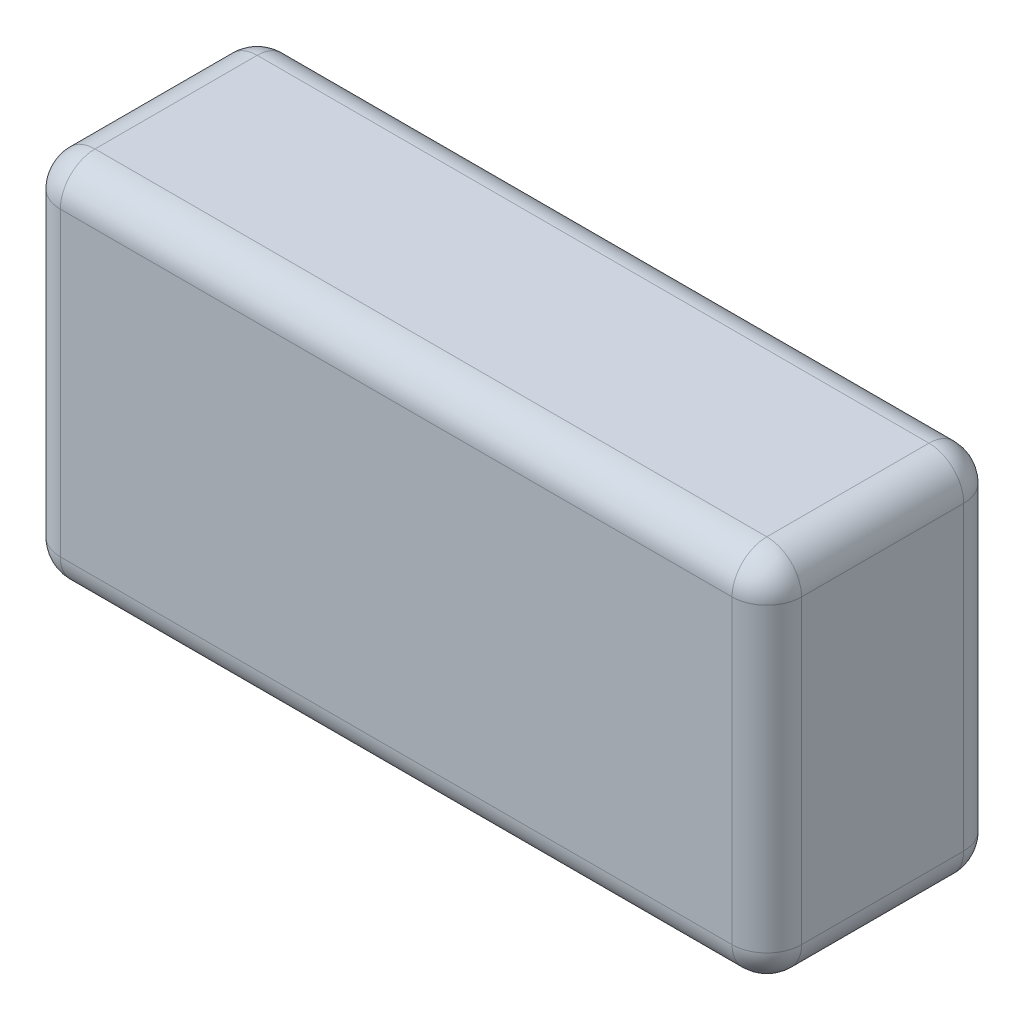
ISO-10303-21;
HEADER;
FILE_DESCRIPTION(('STEP AP214'),'2;1');
FILE_NAME('part.step','',(''),(''),'','','');
FILE_SCHEMA(('AUTOMOTIVE_DESIGN { 1 0 10303 214 1 1 1 1 }'));
ENDSEC;
DATA;
#1=APPLICATION_CONTEXT('core data for automotive mechanical design processes');
#2=APPLICATION_PROTOCOL_DEFINITION('international standard','automotive_design',2000,#1);
#3=PRODUCT_CONTEXT('',#1,'mechanical');
#4=PRODUCT('Part','Part','',(#3));
#5=PRODUCT_RELATED_PRODUCT_CATEGORY('part','',(#4));
#6=PRODUCT_DEFINITION_FORMATION('','',#4);
#7=PRODUCT_DEFINITION_CONTEXT('part definition',#1,'design');
#8=PRODUCT_DEFINITION('design','',#6,#7);
#9=PRODUCT_DEFINITION_SHAPE('','',#8);
#10=(LENGTH_UNIT() NAMED_UNIT(*) SI_UNIT(.MILLI.,.METRE.));
#11=(NAMED_UNIT(*) PLANE_ANGLE_UNIT() SI_UNIT($,.RADIAN.));
#12=(NAMED_UNIT(*) SI_UNIT($,.STERADIAN.) SOLID_ANGLE_UNIT());
#13=UNCERTAINTY_MEASURE_WITH_UNIT(LENGTH_MEASURE(1.E-05),#10,'distance_accuracy_value','');
#14=(GEOMETRIC_REPRESENTATION_CONTEXT(3) GLOBAL_UNCERTAINTY_ASSIGNED_CONTEXT((#13)) GLOBAL_UNIT_ASSIGNED_CONTEXT((#10,
#11,#12)) REPRESENTATION_CONTEXT('',''));
#15=CARTESIAN_POINT('',(0.,0.,0.));
#16=DIRECTION('',(0.,0.,1.));
#17=DIRECTION('',(1.,0.,0.));
#18=AXIS2_PLACEMENT_3D('',#15,#16,#17);
#19=CARTESIAN_POINT('',(-1.45,-0.649999999999998,0.849999999999999));
#20=DIRECTION('',(1.,0.,0.));
#21=DIRECTION('',(0.,0.,1.));
#22=AXIS2_PLACEMENT_3D('',#19,#20,#21);
#23=SPHERICAL_SURFACE('',#22,0.150000000000003);
#24=CARTESIAN_POINT('',(-1.45,-0.65,0.85));
#25=DIRECTION('',(1.,0.,0.));
#26=DIRECTION('',(0.,0.,-1.));
#27=AXIS2_PLACEMENT_3D('',#24,#25,#26);
#28=CIRCLE('',#27,0.15);
#29=CARTESIAN_POINT('',(-1.45,-0.649999999999999,1.));
#30=VERTEX_POINT('',#29);
#31=CARTESIAN_POINT('',(-1.45,-0.8,0.850000000001725));
#32=VERTEX_POINT('',#31);
#33=EDGE_CURVE('E109',#30,#32,#28,.T.);
#34=ORIENTED_EDGE('',*,*,#33,.F.);
#35=CARTESIAN_POINT('',(-1.45,-0.65,0.850000000000004));
#36=DIRECTION('',(0.,-1.,0.));
#37=DIRECTION('',(0.,0.,-1.));
#38=AXIS2_PLACEMENT_3D('',#35,#36,#37);
#39=CIRCLE('',#38,0.149999999999995);
#40=CARTESIAN_POINT('',(-1.6,-0.649999999999999,0.849999999999999));
#41=VERTEX_POINT('',#40);
#42=EDGE_CURVE('E118',#41,#30,#39,.F.);
#43=ORIENTED_EDGE('',*,*,#42,.F.);
#44=CARTESIAN_POINT('',(-1.45000000000001,-0.650000000000005,0.85));
#45=DIRECTION('',(0.,0.,1.));
#46=DIRECTION('',(1.,0.,0.));
#47=AXIS2_PLACEMENT_3D('',#44,#45,#46);
#48=CIRCLE('',#47,0.149999999999994);
#49=EDGE_CURVE('E121',#32,#41,#48,.F.);
#50=ORIENTED_EDGE('',*,*,#49,.F.);
#51=EDGE_LOOP('',(#34,#43,#50));
#52=FACE_BOUND('',#51,.T.);
#53=ADVANCED_FACE('F17',(#52),#23,.T.);
#54=CARTESIAN_POINT('',(1.45,-0.649999999999998,0.849999999999998));
#55=DIRECTION('',(1.,0.,0.));
#56=DIRECTION('',(0.,0.,1.));
#57=AXIS2_PLACEMENT_3D('',#54,#55,#56);
#58=SPHERICAL_SURFACE('',#57,0.150000000000002);
#59=CARTESIAN_POINT('',(1.45,-0.650000000000004,0.85));
#60=DIRECTION('',(0.,0.,1.));
#61=DIRECTION('',(1.,0.,0.));
#62=AXIS2_PLACEMENT_3D('',#59,#60,#61);
#63=CIRCLE('',#62,0.149999999999995);
#64=CARTESIAN_POINT('',(1.6,-0.650000000000001,0.849999999999999));
#65=VERTEX_POINT('',#64);
#66=CARTESIAN_POINT('',(1.45,-0.8,0.85));
#67=VERTEX_POINT('',#66);
#68=EDGE_CURVE('E168',#65,#67,#63,.F.);
#69=ORIENTED_EDGE('',*,*,#68,.F.);
#70=CARTESIAN_POINT('',(1.45,-0.65,0.850000000000004));
#71=DIRECTION('',(0.,1.,0.));
#72=DIRECTION('',(0.,0.,1.));
#73=AXIS2_PLACEMENT_3D('',#70,#71,#72);
#74=CIRCLE('',#73,0.149999999999995);
#75=CARTESIAN_POINT('',(1.45,-0.649999999999999,1.));
#76=VERTEX_POINT('',#75);
#77=EDGE_CURVE('E153',#76,#65,#74,.T.);
#78=ORIENTED_EDGE('',*,*,#77,.F.);
#79=CARTESIAN_POINT('',(1.45,-0.65,0.85));
#80=DIRECTION('',(1.,0.,0.));
#81=DIRECTION('',(0.,0.,-1.));
#82=AXIS2_PLACEMENT_3D('',#79,#80,#81);
#83=CIRCLE('',#82,0.15);
#84=EDGE_CURVE('E111',#67,#76,#83,.F.);
#85=ORIENTED_EDGE('',*,*,#84,.F.);
#86=EDGE_LOOP('',(#69,#78,#85));
#87=FACE_BOUND('',#86,.T.);
#88=ADVANCED_FACE('F137',(#87),#58,.T.);
#89=CARTESIAN_POINT('',(-1.45,-0.65,0.850000000000004));
#90=DIRECTION('',(0.,-1.,0.));
#91=DIRECTION('',(0.,0.,-1.));
#92=AXIS2_PLACEMENT_3D('',#89,#90,#91);
#93=CYLINDRICAL_SURFACE('',#92,0.149999999999995);
#94=CARTESIAN_POINT('',(-1.45,0.649999999999999,0.849999999999999));
#95=DIRECTION('',(0.,-1.,-4.60039669621078E-11));
#96=DIRECTION('',(1.,0.,0.));
#97=AXIS2_PLACEMENT_3D('',#94,#95,#96);
#98=CIRCLE('',#97,0.150000000000001);
#99=CARTESIAN_POINT('',(-1.6,0.65,0.85));
#100=VERTEX_POINT('',#99);
#101=CARTESIAN_POINT('',(-1.45,0.649999999999137,1.));
#102=VERTEX_POINT('',#101);
#103=EDGE_CURVE('E129',#100,#102,#98,.F.);
#104=ORIENTED_EDGE('',*,*,#103,.F.);
#105=DIRECTION('',(0.,1.,0.));
#106=VECTOR('',#105,1.);
#107=CARTESIAN_POINT('',(-1.6,-0.65,0.85));
#108=LINE('',#107,#106);
#109=EDGE_CURVE('E133',#41,#100,#108,.T.);
#110=ORIENTED_EDGE('',*,*,#109,.F.);
#111=ORIENTED_EDGE('',*,*,#42,.T.);
#112=DIRECTION('',(0.,-1.,0.));
#113=VECTOR('',#112,1.);
#114=CARTESIAN_POINT('',(-1.45,-0.65,0.999999999999999));
#115=LINE('',#114,#113);
#116=EDGE_CURVE('E124',#30,#102,#115,.F.);
#117=ORIENTED_EDGE('',*,*,#116,.T.);
#118=EDGE_LOOP('',(#104,#110,#111,#117));
#119=FACE_BOUND('',#118,.T.);
#120=ADVANCED_FACE('F131',(#119),#93,.T.);
#121=CARTESIAN_POINT('',(-1.45,0.649999999999999,0.849999999999999));
#122=DIRECTION('',(1.,0.,0.));
#123=DIRECTION('',(0.,0.,-1.));
#124=AXIS2_PLACEMENT_3D('',#121,#122,#123);
#125=SPHERICAL_SURFACE('',#124,0.150000000000001);
#126=CARTESIAN_POINT('',(-1.45,0.65,0.85));
#127=DIRECTION('',(-1.,0.,0.));
#128=DIRECTION('',(0.,0.,1.));
#129=AXIS2_PLACEMENT_3D('',#126,#127,#128);
#130=CIRCLE('',#129,0.15);
#131=CARTESIAN_POINT('',(-1.45,0.8,0.85));
#132=VERTEX_POINT('',#131);
#133=EDGE_CURVE('E181',#132,#102,#130,.F.);
#134=ORIENTED_EDGE('',*,*,#133,.F.);
#135=CARTESIAN_POINT('',(-1.45,0.650000000000004,0.85));
#136=DIRECTION('',(0.,0.,1.));
#137=DIRECTION('',(1.,0.,0.));
#138=AXIS2_PLACEMENT_3D('',#135,#136,#137);
#139=CIRCLE('',#138,0.149999999999995);
#140=EDGE_CURVE('E175',#100,#132,#139,.F.);
#141=ORIENTED_EDGE('',*,*,#140,.F.);
#142=ORIENTED_EDGE('',*,*,#103,.T.);
#143=EDGE_LOOP('',(#134,#141,#142));
#144=FACE_BOUND('',#143,.T.);
#145=ADVANCED_FACE('F143',(#144),#125,.T.);
#146=CARTESIAN_POINT('',(-1.1,-0.65,1.));
#147=DIRECTION('',(0.,0.,1.));
#148=DIRECTION('',(1.,0.,0.));
#149=AXIS2_PLACEMENT_3D('',#146,#147,#148);
#150=PLANE('',#149);
#151=DIRECTION('',(1.,0.,0.));
#152=VECTOR('',#151,1.);
#153=CARTESIAN_POINT('',(1.45,-0.65,1.));
#154=LINE('',#153,#152);
#155=EDGE_CURVE('E102',#76,#30,#154,.F.);
#156=ORIENTED_EDGE('',*,*,#155,.F.);
#157=DIRECTION('',(0.,1.,0.));
#158=VECTOR('',#157,1.);
#159=CARTESIAN_POINT('',(1.45,0.65,0.999999999999999));
#160=LINE('',#159,#158);
#161=CARTESIAN_POINT('',(1.45,0.65,1.));
#162=VERTEX_POINT('',#161);
#163=EDGE_CURVE('E113',#162,#76,#160,.F.);
#164=ORIENTED_EDGE('',*,*,#163,.F.);
#165=DIRECTION('',(-1.,0.,0.));
#166=VECTOR('',#165,1.);
#167=CARTESIAN_POINT('',(1.1,0.65,1.));
#168=LINE('',#167,#166);
#169=EDGE_CURVE('E126',#102,#162,#168,.F.);
#170=ORIENTED_EDGE('',*,*,#169,.F.);
#171=ORIENTED_EDGE('',*,*,#116,.F.);
#172=EDGE_LOOP('',(#156,#164,#170,#171));
#173=FACE_BOUND('',#172,.T.);
#174=ADVANCED_FACE('F125',(#173),#150,.T.);
#175=CARTESIAN_POINT('',(1.45,0.650000000000001,0.850000000000001));
#176=DIRECTION('',(1.,0.,0.));
#177=DIRECTION('',(0.,0.,-1.));
#178=AXIS2_PLACEMENT_3D('',#175,#176,#177);
#179=SPHERICAL_SURFACE('',#178,0.149999999999998);
#180=CARTESIAN_POINT('',(1.45000000000001,0.650000000000005,0.85));
#181=DIRECTION('',(0.,0.,1.));
#182=DIRECTION('',(1.,0.,0.));
#183=AXIS2_PLACEMENT_3D('',#180,#181,#182);
#184=CIRCLE('',#183,0.149999999999994);
#185=CARTESIAN_POINT('',(1.45,0.8,0.849999999998083));
#186=VERTEX_POINT('',#185);
#187=CARTESIAN_POINT('',(1.6,0.650000000000003,0.850000000000001));
#188=VERTEX_POINT('',#187);
#189=EDGE_CURVE('E187',#186,#188,#184,.F.);
#190=ORIENTED_EDGE('',*,*,#189,.F.);
#191=CARTESIAN_POINT('',(1.45,0.65,0.85));
#192=DIRECTION('',(-1.,0.,0.));
#193=DIRECTION('',(0.,0.,1.));
#194=AXIS2_PLACEMENT_3D('',#191,#192,#193);
#195=CIRCLE('',#194,0.15);
#196=EDGE_CURVE('E184',#162,#186,#195,.T.);
#197=ORIENTED_EDGE('',*,*,#196,.F.);
#198=CARTESIAN_POINT('',(1.45,0.65,0.850000000000004));
#199=DIRECTION('',(0.,1.,0.));
#200=DIRECTION('',(0.,0.,1.));
#201=AXIS2_PLACEMENT_3D('',#198,#199,#200);
#202=CIRCLE('',#201,0.149999999999995);
#203=EDGE_CURVE('E158',#188,#162,#202,.F.);
#204=ORIENTED_EDGE('',*,*,#203,.F.);
#205=EDGE_LOOP('',(#190,#197,#204));
#206=FACE_BOUND('',#205,.T.);
#207=ADVANCED_FACE('F257',(#206),#179,.T.);
#208=CARTESIAN_POINT('',(1.45,0.65,0.850000000000004));
#209=DIRECTION('',(0.,1.,0.));
#210=DIRECTION('',(0.,0.,1.));
#211=AXIS2_PLACEMENT_3D('',#208,#209,#210);
#212=CYLINDRICAL_SURFACE('',#211,0.149999999999995);
#213=ORIENTED_EDGE('',*,*,#203,.T.);
#214=ORIENTED_EDGE('',*,*,#163,.T.);
#215=ORIENTED_EDGE('',*,*,#77,.T.);
#216=DIRECTION('',(0.,1.,0.));
#217=VECTOR('',#216,1.);
#218=CARTESIAN_POINT('',(1.6,0.65,0.85));
#219=LINE('',#218,#217);
#220=EDGE_CURVE('E196',#188,#65,#219,.F.);
#221=ORIENTED_EDGE('',*,*,#220,.F.);
#222=EDGE_LOOP('',(#213,#214,#215,#221));
#223=FACE_BOUND('',#222,.T.);
#224=ADVANCED_FACE('F255',(#223),#212,.T.);
#225=CARTESIAN_POINT('',(1.45,-0.65,0.85));
#226=DIRECTION('',(1.,0.,0.));
#227=DIRECTION('',(0.,0.,-1.));
#228=AXIS2_PLACEMENT_3D('',#225,#226,#227);
#229=CYLINDRICAL_SURFACE('',#228,0.15);
#230=DIRECTION('',(1.,0.,0.));
#231=VECTOR('',#230,1.);
#232=CARTESIAN_POINT('',(1.1,-0.8,0.85));
#233=LINE('',#232,#231);
#234=EDGE_CURVE('E201',#67,#32,#233,.F.);
#235=ORIENTED_EDGE('',*,*,#234,.F.);
#236=ORIENTED_EDGE('',*,*,#84,.T.);
#237=ORIENTED_EDGE('',*,*,#155,.T.);
#238=ORIENTED_EDGE('',*,*,#33,.T.);
#239=EDGE_LOOP('',(#235,#236,#237,#238));
#240=FACE_BOUND('',#239,.T.);
#241=ADVANCED_FACE('F108',(#240),#229,.T.);
#242=CARTESIAN_POINT('',(-1.45000000000001,-0.650000000000005,0.85));
#243=DIRECTION('',(0.,0.,1.));
#244=DIRECTION('',(1.,0.,0.));
#245=AXIS2_PLACEMENT_3D('',#242,#243,#244);
#246=CYLINDRICAL_SURFACE('',#245,0.149999999999994);
#247=ORIENTED_EDGE('',*,*,#49,.T.);
#248=DIRECTION('',(0.,0.,1.));
#249=VECTOR('',#248,1.);
#250=CARTESIAN_POINT('',(-1.6,-0.65,0.15));
#251=LINE('',#250,#249);
#252=CARTESIAN_POINT('',(-1.6,-0.65,0.15));
#253=VERTEX_POINT('',#252);
#254=EDGE_CURVE('E172',#253,#41,#251,.T.);
#255=ORIENTED_EDGE('',*,*,#254,.F.);
#256=CARTESIAN_POINT('',(-1.45,-0.649999999999998,0.150000000000001));
#257=DIRECTION('',(0.,0.,-1.));
#258=DIRECTION('',(1.,0.,0.));
#259=AXIS2_PLACEMENT_3D('',#256,#257,#258);
#260=CIRCLE('',#259,0.150000000000002);
#261=CARTESIAN_POINT('',(-1.45,-0.799999999999999,0.15));
#262=VERTEX_POINT('',#261);
#263=EDGE_CURVE('E206',#262,#253,#260,.T.);
#264=ORIENTED_EDGE('',*,*,#263,.F.);
#265=DIRECTION('',(0.,0.,-1.));
#266=VECTOR('',#265,1.);
#267=CARTESIAN_POINT('',(-1.45,-0.8,0.15));
#268=LINE('',#267,#266);
#269=EDGE_CURVE('E203',#32,#262,#268,.T.);
#270=ORIENTED_EDGE('',*,*,#269,.F.);
#271=EDGE_LOOP('',(#247,#255,#264,#270));
#272=FACE_BOUND('',#271,.T.);
#273=ADVANCED_FACE('F248',(#272),#246,.T.);
#274=CARTESIAN_POINT('',(1.45,-0.650000000000004,0.85));
#275=DIRECTION('',(0.,0.,1.));
#276=DIRECTION('',(1.,0.,0.));
#277=AXIS2_PLACEMENT_3D('',#274,#275,#276);
#278=CYLINDRICAL_SURFACE('',#277,0.149999999999995);
#279=CARTESIAN_POINT('',(1.45,-0.649999999999999,0.150000000000001));
#280=DIRECTION('',(0.,4.72852255648652E-11,-1.));
#281=DIRECTION('',(1.,0.,0.));
#282=AXIS2_PLACEMENT_3D('',#279,#280,#281);
#283=CIRCLE('',#282,0.150000000000003);
#284=CARTESIAN_POINT('',(1.6,-0.650000000000001,0.15));
#285=VERTEX_POINT('',#284);
#286=CARTESIAN_POINT('',(1.45,-0.8,0.149999999999113));
#287=VERTEX_POINT('',#286);
#288=EDGE_CURVE('E209',#285,#287,#283,.T.);
#289=ORIENTED_EDGE('',*,*,#288,.F.);
#290=DIRECTION('',(0.,0.,-1.));
#291=VECTOR('',#290,1.);
#292=CARTESIAN_POINT('',(1.6,-0.65,0.15));
#293=LINE('',#292,#291);
#294=EDGE_CURVE('E190',#65,#285,#293,.T.);
#295=ORIENTED_EDGE('',*,*,#294,.F.);
#296=ORIENTED_EDGE('',*,*,#68,.T.);
#297=DIRECTION('',(0.,0.,-1.));
#298=VECTOR('',#297,1.);
#299=CARTESIAN_POINT('',(1.45,-0.8,0.15));
#300=LINE('',#299,#298);
#301=EDGE_CURVE('E198',#287,#67,#300,.F.);
#302=ORIENTED_EDGE('',*,*,#301,.F.);
#303=EDGE_LOOP('',(#289,#295,#296,#302));
#304=FACE_BOUND('',#303,.T.);
#305=ADVANCED_FACE('F244',(#304),#278,.T.);
#306=CARTESIAN_POINT('',(-1.6,-0.65,0.15));
#307=DIRECTION('',(-1.,0.,0.));
#308=DIRECTION('',(0.,0.,1.));
#309=AXIS2_PLACEMENT_3D('',#306,#307,#308);
#310=PLANE('',#309);
#311=DIRECTION('',(0.,1.,0.));
#312=VECTOR('',#311,1.);
#313=CARTESIAN_POINT('',(-1.59999999999999,0.65,0.15));
#314=LINE('',#313,#312);
#315=CARTESIAN_POINT('',(-1.6,0.650000000000001,0.15));
#316=VERTEX_POINT('',#315);
#317=EDGE_CURVE('E329',#253,#316,#314,.T.);
#318=ORIENTED_EDGE('',*,*,#317,.F.);
#319=ORIENTED_EDGE('',*,*,#254,.T.);
#320=ORIENTED_EDGE('',*,*,#109,.T.);
#321=DIRECTION('',(0.,0.,1.));
#322=VECTOR('',#321,1.);
#323=CARTESIAN_POINT('',(-1.59999999999999,0.65,0.85));
#324=LINE('',#323,#322);
#325=EDGE_CURVE('E178',#316,#100,#324,.T.);
#326=ORIENTED_EDGE('',*,*,#325,.F.);
#327=EDGE_LOOP('',(#318,#319,#320,#326));
#328=FACE_BOUND('',#327,.T.);
#329=ADVANCED_FACE('F240',(#328),#310,.T.);
#330=CARTESIAN_POINT('',(-1.45,0.650000000000004,0.85));
#331=DIRECTION('',(0.,0.,1.));
#332=DIRECTION('',(1.,0.,0.));
#333=AXIS2_PLACEMENT_3D('',#330,#331,#332);
#334=CYLINDRICAL_SURFACE('',#333,0.149999999999995);
#335=CARTESIAN_POINT('',(-1.45,0.650000000000002,0.149999999999999));
#336=DIRECTION('',(0.,-4.600217782274E-11,1.));
#337=DIRECTION('',(1.,0.,0.));
#338=AXIS2_PLACEMENT_3D('',#335,#336,#337);
#339=CIRCLE('',#338,0.149999999999998);
#340=CARTESIAN_POINT('',(-1.45,0.799999999999999,0.150000000001725));
#341=VERTEX_POINT('',#340);
#342=EDGE_CURVE('E306',#316,#341,#339,.F.);
#343=ORIENTED_EDGE('',*,*,#342,.F.);
#344=ORIENTED_EDGE('',*,*,#325,.T.);
#345=ORIENTED_EDGE('',*,*,#140,.T.);
#346=DIRECTION('',(0.,0.,1.));
#347=VECTOR('',#346,1.);
#348=CARTESIAN_POINT('',(-1.45,0.8,0.15));
#349=LINE('',#348,#347);
#350=EDGE_CURVE('E303',#341,#132,#349,.T.);
#351=ORIENTED_EDGE('',*,*,#350,.F.);
#352=EDGE_LOOP('',(#343,#344,#345,#351));
#353=FACE_BOUND('',#352,.T.);
#354=ADVANCED_FACE('F236',(#353),#334,.T.);
#355=CARTESIAN_POINT('',(1.1,0.65,0.85));
#356=DIRECTION('',(-1.,0.,0.));
#357=DIRECTION('',(0.,0.,1.));
#358=AXIS2_PLACEMENT_3D('',#355,#356,#357);
#359=CYLINDRICAL_SURFACE('',#358,0.15);
#360=ORIENTED_EDGE('',*,*,#169,.T.);
#361=ORIENTED_EDGE('',*,*,#196,.T.);
#362=DIRECTION('',(1.,0.,0.));
#363=VECTOR('',#362,1.);
#364=CARTESIAN_POINT('',(-1.1,0.8,0.85));
#365=LINE('',#364,#363);
#366=EDGE_CURVE('E301',#132,#186,#365,.T.);
#367=ORIENTED_EDGE('',*,*,#366,.F.);
#368=ORIENTED_EDGE('',*,*,#133,.T.);
#369=EDGE_LOOP('',(#360,#361,#367,#368));
#370=FACE_BOUND('',#369,.T.);
#371=ADVANCED_FACE('F232',(#370),#359,.T.);
#372=CARTESIAN_POINT('',(1.45000000000001,0.650000000000005,0.85));
#373=DIRECTION('',(0.,0.,1.));
#374=DIRECTION('',(1.,0.,0.));
#375=AXIS2_PLACEMENT_3D('',#372,#373,#374);
#376=CYLINDRICAL_SURFACE('',#375,0.149999999999994);
#377=CARTESIAN_POINT('',(1.45,0.649999999999999,0.150000000000001));
#378=DIRECTION('',(0.,0.,1.));
#379=DIRECTION('',(1.,0.,0.));
#380=AXIS2_PLACEMENT_3D('',#377,#378,#379);
#381=CIRCLE('',#380,0.150000000000001);
#382=CARTESIAN_POINT('',(1.45,0.799999999999999,0.15));
#383=VERTEX_POINT('',#382);
#384=CARTESIAN_POINT('',(1.6,0.650000000000003,0.15));
#385=VERTEX_POINT('',#384);
#386=EDGE_CURVE('E295',#383,#385,#381,.F.);
#387=ORIENTED_EDGE('',*,*,#386,.F.);
#388=DIRECTION('',(0.,0.,1.));
#389=VECTOR('',#388,1.);
#390=CARTESIAN_POINT('',(1.45,0.8,0.15));
#391=LINE('',#390,#389);
#392=EDGE_CURVE('E298',#186,#383,#391,.F.);
#393=ORIENTED_EDGE('',*,*,#392,.F.);
#394=ORIENTED_EDGE('',*,*,#189,.T.);
#395=DIRECTION('',(0.,0.,-1.));
#396=VECTOR('',#395,1.);
#397=CARTESIAN_POINT('',(1.6,0.65,0.15));
#398=LINE('',#397,#396);
#399=EDGE_CURVE('E193',#385,#188,#398,.F.);
#400=ORIENTED_EDGE('',*,*,#399,.F.);
#401=EDGE_LOOP('',(#387,#393,#394,#400));
#402=FACE_BOUND('',#401,.T.);
#403=ADVANCED_FACE('F228',(#402),#376,.T.);
#404=CARTESIAN_POINT('',(1.6,0.65,0.15));
#405=DIRECTION('',(1.,0.,0.));
#406=DIRECTION('',(0.,0.,-1.));
#407=AXIS2_PLACEMENT_3D('',#404,#405,#406);
#408=PLANE('',#407);
#409=ORIENTED_EDGE('',*,*,#399,.T.);
#410=ORIENTED_EDGE('',*,*,#220,.T.);
#411=ORIENTED_EDGE('',*,*,#294,.T.);
#412=DIRECTION('',(0.,-1.,0.));
#413=VECTOR('',#412,1.);
#414=CARTESIAN_POINT('',(1.59999999999999,-0.65,0.15));
#415=LINE('',#414,#413);
#416=EDGE_CURVE('E353',#385,#285,#415,.T.);
#417=ORIENTED_EDGE('',*,*,#416,.F.);
#418=EDGE_LOOP('',(#409,#410,#411,#417));
#419=FACE_BOUND('',#418,.T.);
#420=ADVANCED_FACE('F224',(#419),#408,.T.);
#421=CARTESIAN_POINT('',(-1.1,-0.8,0.15));
#422=DIRECTION('',(0.,-1.,0.));
#423=DIRECTION('',(0.,0.,-1.));
#424=AXIS2_PLACEMENT_3D('',#421,#422,#423);
#425=PLANE('',#424);
#426=ORIENTED_EDGE('',*,*,#269,.T.);
#427=DIRECTION('',(-1.,0.,0.));
#428=VECTOR('',#427,1.);
#429=CARTESIAN_POINT('',(1.1,-0.8,0.15));
#430=LINE('',#429,#428);
#431=EDGE_CURVE('E350',#287,#262,#430,.T.);
#432=ORIENTED_EDGE('',*,*,#431,.F.);
#433=ORIENTED_EDGE('',*,*,#301,.T.);
#434=ORIENTED_EDGE('',*,*,#234,.T.);
#435=EDGE_LOOP('',(#426,#432,#433,#434));
#436=FACE_BOUND('',#435,.T.);
#437=ADVANCED_FACE('F219',(#436),#425,.T.);
#438=CARTESIAN_POINT('',(-1.45,-0.649999999999998,0.150000000000001));
#439=DIRECTION('',(1.,0.,0.));
#440=DIRECTION('',(0.,0.,1.));
#441=AXIS2_PLACEMENT_3D('',#438,#439,#440);
#442=SPHERICAL_SURFACE('',#441,0.150000000000002);
#443=ORIENTED_EDGE('',*,*,#263,.T.);
#444=CARTESIAN_POINT('',(-1.45,-0.65,0.149999999999996));
#445=DIRECTION('',(0.,1.,0.));
#446=DIRECTION('',(0.,0.,1.));
#447=AXIS2_PLACEMENT_3D('',#444,#445,#446);
#448=CIRCLE('',#447,0.149999999999995);
#449=CARTESIAN_POINT('',(-1.45,-0.650000000002298,0.));
#450=VERTEX_POINT('',#449);
#451=EDGE_CURVE('E370',#450,#253,#448,.T.);
#452=ORIENTED_EDGE('',*,*,#451,.F.);
#453=CARTESIAN_POINT('',(-1.45,-0.65,0.15));
#454=DIRECTION('',(-1.,0.,0.));
#455=DIRECTION('',(0.,0.,1.));
#456=AXIS2_PLACEMENT_3D('',#453,#454,#455);
#457=CIRCLE('',#456,0.15);
#458=EDGE_CURVE('E348',#262,#450,#457,.F.);
#459=ORIENTED_EDGE('',*,*,#458,.F.);
#460=EDGE_LOOP('',(#443,#452,#459));
#461=FACE_BOUND('',#460,.T.);
#462=ADVANCED_FACE('F214',(#461),#442,.T.);
#463=CARTESIAN_POINT('',(1.45,-0.649999999999999,0.150000000000001));
#464=DIRECTION('',(1.,0.,0.));
#465=DIRECTION('',(0.,0.,1.));
#466=AXIS2_PLACEMENT_3D('',#463,#464,#465);
#467=SPHERICAL_SURFACE('',#466,0.150000000000003);
#468=ORIENTED_EDGE('',*,*,#288,.T.);
#469=CARTESIAN_POINT('',(1.45,-0.65,0.15));
#470=DIRECTION('',(-1.,0.,0.));
#471=DIRECTION('',(0.,0.,1.));
#472=AXIS2_PLACEMENT_3D('',#469,#470,#471);
#473=CIRCLE('',#472,0.15);
#474=CARTESIAN_POINT('',(1.45,-0.65,0.));
#475=VERTEX_POINT('',#474);
#476=EDGE_CURVE('E337',#475,#287,#473,.T.);
#477=ORIENTED_EDGE('',*,*,#476,.F.);
#478=CARTESIAN_POINT('',(1.45,-0.65,0.149999999999996));
#479=DIRECTION('',(0.,-1.,0.));
#480=DIRECTION('',(0.,0.,-1.));
#481=AXIS2_PLACEMENT_3D('',#478,#479,#480);
#482=CIRCLE('',#481,0.149999999999995);
#483=EDGE_CURVE('E293',#285,#475,#482,.F.);
#484=ORIENTED_EDGE('',*,*,#483,.F.);
#485=EDGE_LOOP('',(#468,#477,#484));
#486=FACE_BOUND('',#485,.T.);
#487=ADVANCED_FACE('F218',(#486),#467,.T.);
#488=CARTESIAN_POINT('',(-1.45,0.65,0.149999999999996));
#489=DIRECTION('',(0.,1.,0.));
#490=DIRECTION('',(0.,0.,1.));
#491=AXIS2_PLACEMENT_3D('',#488,#489,#490);
#492=CYLINDRICAL_SURFACE('',#491,0.149999999999995);
#493=CARTESIAN_POINT('',(-1.45,0.650000000000002,0.149999999999999));
#494=DIRECTION('',(0.,1.,0.));
#495=DIRECTION('',(1.,0.,0.));
#496=AXIS2_PLACEMENT_3D('',#493,#494,#495);
#497=CIRCLE('',#496,0.149999999999998);
#498=CARTESIAN_POINT('',(-1.45,0.65,0.));
#499=VERTEX_POINT('',#498);
#500=EDGE_CURVE('E324',#499,#316,#497,.T.);
#501=ORIENTED_EDGE('',*,*,#500,.F.);
#502=DIRECTION('',(0.,1.,0.));
#503=VECTOR('',#502,1.);
#504=CARTESIAN_POINT('',(-1.45,0.65,0.));
#505=LINE('',#504,#503);
#506=EDGE_CURVE('E327',#450,#499,#505,.T.);
#507=ORIENTED_EDGE('',*,*,#506,.F.);
#508=ORIENTED_EDGE('',*,*,#451,.T.);
#509=ORIENTED_EDGE('',*,*,#317,.T.);
#510=EDGE_LOOP('',(#501,#507,#508,#509));
#511=FACE_BOUND('',#510,.T.);
#512=ADVANCED_FACE('F312',(#511),#492,.T.);
#513=CARTESIAN_POINT('',(-1.45,0.650000000000002,0.149999999999999));
#514=DIRECTION('',(1.,0.,0.));
#515=DIRECTION('',(0.,0.,-1.));
#516=AXIS2_PLACEMENT_3D('',#513,#514,#515);
#517=SPHERICAL_SURFACE('',#516,0.149999999999998);
#518=ORIENTED_EDGE('',*,*,#500,.T.);
#519=ORIENTED_EDGE('',*,*,#342,.T.);
#520=CARTESIAN_POINT('',(-1.45,0.65,0.15));
#521=DIRECTION('',(1.,0.,0.));
#522=DIRECTION('',(0.,0.,-1.));
#523=AXIS2_PLACEMENT_3D('',#520,#521,#522);
#524=CIRCLE('',#523,0.15);
#525=EDGE_CURVE('E336',#499,#341,#524,.T.);
#526=ORIENTED_EDGE('',*,*,#525,.F.);
#527=EDGE_LOOP('',(#518,#519,#526));
#528=FACE_BOUND('',#527,.T.);
#529=ADVANCED_FACE('F310',(#528),#517,.T.);
#530=CARTESIAN_POINT('',(1.1,0.8,0.15));
#531=DIRECTION('',(0.,1.,0.));
#532=DIRECTION('',(0.,0.,1.));
#533=AXIS2_PLACEMENT_3D('',#530,#531,#532);
#534=PLANE('',#533);
#535=ORIENTED_EDGE('',*,*,#392,.T.);
#536=DIRECTION('',(1.,0.,0.));
#537=VECTOR('',#536,1.);
#538=CARTESIAN_POINT('',(1.45,0.8,0.15));
#539=LINE('',#538,#537);
#540=EDGE_CURVE('E341',#341,#383,#539,.T.);
#541=ORIENTED_EDGE('',*,*,#540,.F.);
#542=ORIENTED_EDGE('',*,*,#350,.T.);
#543=ORIENTED_EDGE('',*,*,#366,.T.);
#544=EDGE_LOOP('',(#535,#541,#542,#543));
#545=FACE_BOUND('',#544,.T.);
#546=ADVANCED_FACE('F287',(#545),#534,.T.);
#547=CARTESIAN_POINT('',(1.45,0.649999999999999,0.150000000000001));
#548=DIRECTION('',(1.,0.,0.));
#549=DIRECTION('',(0.,0.,-1.));
#550=AXIS2_PLACEMENT_3D('',#547,#548,#549);
#551=SPHERICAL_SURFACE('',#550,0.150000000000001);
#552=CARTESIAN_POINT('',(1.45,0.65,0.149999999999996));
#553=DIRECTION('',(0.,-1.,0.));
#554=DIRECTION('',(0.,0.,-1.));
#555=AXIS2_PLACEMENT_3D('',#552,#553,#554);
#556=CIRCLE('',#555,0.149999999999995);
#557=CARTESIAN_POINT('',(1.45,0.649999999999999,0.));
#558=VERTEX_POINT('',#557);
#559=EDGE_CURVE('E355',#558,#385,#556,.T.);
#560=ORIENTED_EDGE('',*,*,#559,.F.);
#561=CARTESIAN_POINT('',(1.45,0.65,0.15));
#562=DIRECTION('',(1.,0.,0.));
#563=DIRECTION('',(0.,0.,-1.));
#564=AXIS2_PLACEMENT_3D('',#561,#562,#563);
#565=CIRCLE('',#564,0.15);
#566=EDGE_CURVE('E343',#383,#558,#565,.F.);
#567=ORIENTED_EDGE('',*,*,#566,.F.);
#568=ORIENTED_EDGE('',*,*,#386,.T.);
#569=EDGE_LOOP('',(#560,#567,#568));
#570=FACE_BOUND('',#569,.T.);
#571=ADVANCED_FACE('F282',(#570),#551,.T.);
#572=CARTESIAN_POINT('',(1.45,-0.65,0.149999999999996));
#573=DIRECTION('',(0.,-1.,0.));
#574=DIRECTION('',(0.,0.,-1.));
#575=AXIS2_PLACEMENT_3D('',#572,#573,#574);
#576=CYLINDRICAL_SURFACE('',#575,0.149999999999995);
#577=ORIENTED_EDGE('',*,*,#559,.T.);
#578=ORIENTED_EDGE('',*,*,#416,.T.);
#579=ORIENTED_EDGE('',*,*,#483,.T.);
#580=DIRECTION('',(0.,1.,0.));
#581=VECTOR('',#580,1.);
#582=CARTESIAN_POINT('',(1.45,0.65,0.));
#583=LINE('',#582,#581);
#584=EDGE_CURVE('E360',#558,#475,#583,.F.);
#585=ORIENTED_EDGE('',*,*,#584,.F.);
#586=EDGE_LOOP('',(#577,#578,#579,#585));
#587=FACE_BOUND('',#586,.T.);
#588=ADVANCED_FACE('F279',(#587),#576,.T.);
#589=CARTESIAN_POINT('',(1.1,-0.65,0.15));
#590=DIRECTION('',(-1.,0.,0.));
#591=DIRECTION('',(0.,0.,1.));
#592=AXIS2_PLACEMENT_3D('',#589,#590,#591);
#593=CYLINDRICAL_SURFACE('',#592,0.15);
#594=DIRECTION('',(-1.,0.,0.));
#595=VECTOR('',#594,1.);
#596=CARTESIAN_POINT('',(-1.1,-0.65,0.));
#597=LINE('',#596,#595);
#598=EDGE_CURVE('E26',#475,#450,#597,.T.);
#599=ORIENTED_EDGE('',*,*,#598,.F.);
#600=ORIENTED_EDGE('',*,*,#476,.T.);
#601=ORIENTED_EDGE('',*,*,#431,.T.);
#602=ORIENTED_EDGE('',*,*,#458,.T.);
#603=EDGE_LOOP('',(#599,#600,#601,#602));
#604=FACE_BOUND('',#603,.T.);
#605=ADVANCED_FACE('F273',(#604),#593,.T.);
#606=CARTESIAN_POINT('',(1.45,0.65,0.15));
#607=DIRECTION('',(1.,0.,0.));
#608=DIRECTION('',(0.,0.,-1.));
#609=AXIS2_PLACEMENT_3D('',#606,#607,#608);
#610=CYLINDRICAL_SURFACE('',#609,0.15);
#611=ORIENTED_EDGE('',*,*,#540,.T.);
#612=ORIENTED_EDGE('',*,*,#566,.T.);
#613=DIRECTION('',(-1.,0.,0.));
#614=VECTOR('',#613,1.);
#615=CARTESIAN_POINT('',(-1.1,0.65,0.));
#616=LINE('',#615,#614);
#617=EDGE_CURVE('E11',#499,#558,#616,.F.);
#618=ORIENTED_EDGE('',*,*,#617,.F.);
#619=ORIENTED_EDGE('',*,*,#525,.T.);
#620=EDGE_LOOP('',(#611,#612,#618,#619));
#621=FACE_BOUND('',#620,.T.);
#622=ADVANCED_FACE('F267',(#621),#610,.T.);
#623=CARTESIAN_POINT('',(-1.1,0.65,0.));
#624=DIRECTION('',(0.,0.,-1.));
#625=DIRECTION('',(-1.,0.,0.));
#626=AXIS2_PLACEMENT_3D('',#623,#624,#625);
#627=PLANE('',#626);
#628=ORIENTED_EDGE('',*,*,#617,.T.);
#629=ORIENTED_EDGE('',*,*,#584,.T.);
#630=ORIENTED_EDGE('',*,*,#598,.T.);
#631=ORIENTED_EDGE('',*,*,#506,.T.);
#632=EDGE_LOOP('',(#628,#629,#630,#631));
#633=FACE_BOUND('',#632,.T.);
#634=ADVANCED_FACE('F265',(#633),#627,.T.);
#635=CLOSED_SHELL('',(#53,#88,#120,#145,#174,#207,#224,#241,#273,#305,#329,#354,#371,#403,#420,
#437,#462,#487,#512,#529,#546,#571,#588,#605,#622,#634));
#636=MANIFOLD_SOLID_BREP('B1',#635);
#637=ADVANCED_BREP_SHAPE_REPRESENTATION('',(#18,#636),#14);
#638=SHAPE_DEFINITION_REPRESENTATION(#9,#637);
ENDSEC;
END-ISO-10303-21;
